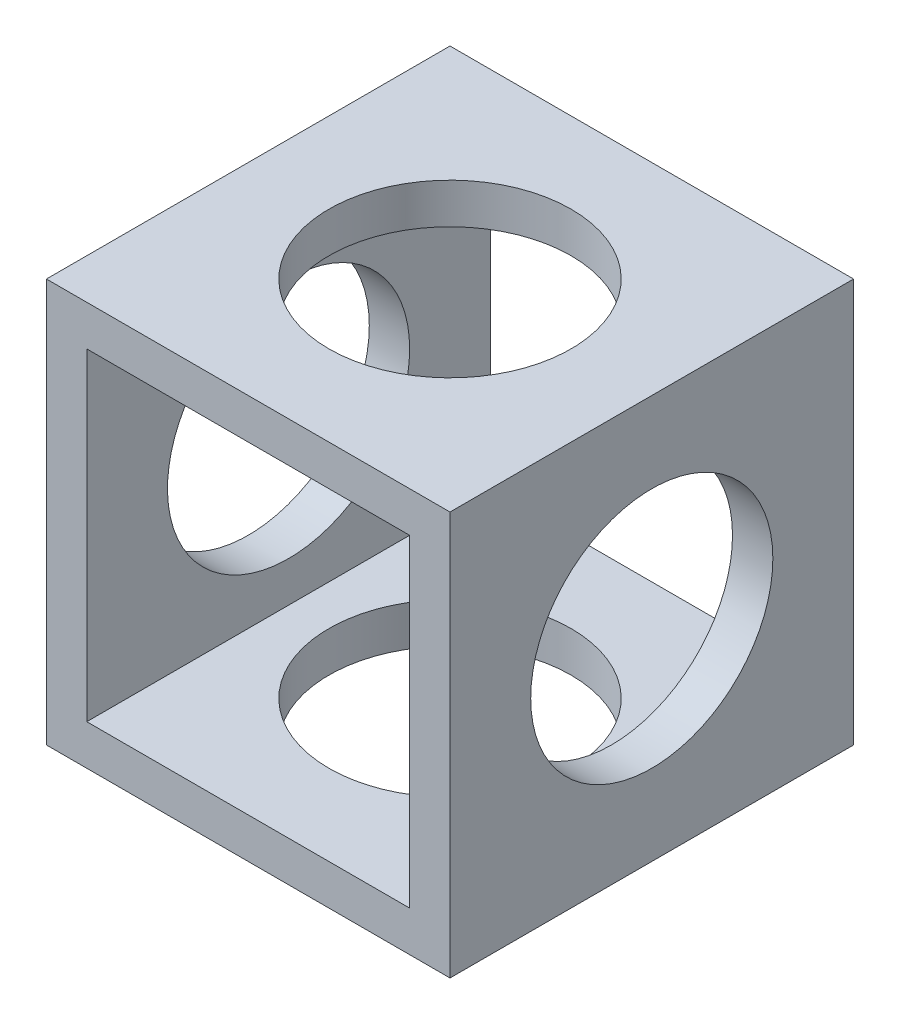
ISO-10303-21;
HEADER;
FILE_DESCRIPTION(('STEP AP214'),'2;1');
FILE_NAME('part.step','',(''),(''),'','','');
FILE_SCHEMA(('AUTOMOTIVE_DESIGN { 1 0 10303 214 1 1 1 1 }'));
ENDSEC;
DATA;
#1=APPLICATION_CONTEXT('core data for automotive mechanical design processes');
#2=APPLICATION_PROTOCOL_DEFINITION('international standard','automotive_design',2000,#1);
#3=PRODUCT_CONTEXT('',#1,'mechanical');
#4=PRODUCT('Part','Part','',(#3));
#5=PRODUCT_RELATED_PRODUCT_CATEGORY('part','',(#4));
#6=PRODUCT_DEFINITION_FORMATION('','',#4);
#7=PRODUCT_DEFINITION_CONTEXT('part definition',#1,'design');
#8=PRODUCT_DEFINITION('design','',#6,#7);
#9=PRODUCT_DEFINITION_SHAPE('','',#8);
#10=(LENGTH_UNIT() NAMED_UNIT(*) SI_UNIT(.MILLI.,.METRE.));
#11=(NAMED_UNIT(*) PLANE_ANGLE_UNIT() SI_UNIT($,.RADIAN.));
#12=(NAMED_UNIT(*) SI_UNIT($,.STERADIAN.) SOLID_ANGLE_UNIT());
#13=UNCERTAINTY_MEASURE_WITH_UNIT(LENGTH_MEASURE(1.E-05),#10,'distance_accuracy_value','');
#14=(GEOMETRIC_REPRESENTATION_CONTEXT(3) GLOBAL_UNCERTAINTY_ASSIGNED_CONTEXT((#13)) GLOBAL_UNIT_ASSIGNED_CONTEXT((#10,
#11,#12)) REPRESENTATION_CONTEXT('',''));
#15=CARTESIAN_POINT('',(0.,0.,0.));
#16=DIRECTION('',(0.,0.,1.));
#17=DIRECTION('',(1.,0.,0.));
#18=AXIS2_PLACEMENT_3D('',#15,#16,#17);
#19=CARTESIAN_POINT('',(0.,0.,25.));
#20=DIRECTION('',(0.,0.,1.));
#21=DIRECTION('',(1.,0.,0.));
#22=AXIS2_PLACEMENT_3D('',#19,#20,#21);
#23=PLANE('',#22);
#24=DIRECTION('',(0.,1.,0.));
#25=VECTOR('',#24,1.);
#26=CARTESIAN_POINT('',(25.,25.,25.));
#27=LINE('',#26,#25);
#28=CARTESIAN_POINT('',(25.,-25.,25.));
#29=VERTEX_POINT('',#28);
#30=CARTESIAN_POINT('',(25.,25.,25.));
#31=VERTEX_POINT('',#30);
#32=EDGE_CURVE('E161',#29,#31,#27,.T.);
#33=ORIENTED_EDGE('',*,*,#32,.T.);
#34=DIRECTION('',(-1.,0.,0.));
#35=VECTOR('',#34,1.);
#36=CARTESIAN_POINT('',(-25.,25.,25.));
#37=LINE('',#36,#35);
#38=CARTESIAN_POINT('',(-25.,25.,25.));
#39=VERTEX_POINT('',#38);
#40=EDGE_CURVE('E165',#31,#39,#37,.T.);
#41=ORIENTED_EDGE('',*,*,#40,.T.);
#42=DIRECTION('',(0.,-1.,0.));
#43=VECTOR('',#42,1.);
#44=CARTESIAN_POINT('',(-25.,25.,25.));
#45=LINE('',#44,#43);
#46=CARTESIAN_POINT('',(-25.,-25.,25.));
#47=VERTEX_POINT('',#46);
#48=EDGE_CURVE('E169',#39,#47,#45,.T.);
#49=ORIENTED_EDGE('',*,*,#48,.T.);
#50=DIRECTION('',(1.,0.,0.));
#51=VECTOR('',#50,1.);
#52=CARTESIAN_POINT('',(-25.,-25.,25.));
#53=LINE('',#52,#51);
#54=EDGE_CURVE('E172',#47,#29,#53,.T.);
#55=ORIENTED_EDGE('',*,*,#54,.T.);
#56=EDGE_LOOP('',(#33,#41,#49,#55));
#57=FACE_BOUND('',#56,.T.);
#58=DIRECTION('',(1.,0.,0.));
#59=VECTOR('',#58,1.);
#60=CARTESIAN_POINT('',(-20.,-20.,25.));
#61=LINE('',#60,#59);
#62=CARTESIAN_POINT('',(-20.,-20.,25.));
#63=VERTEX_POINT('',#62);
#64=CARTESIAN_POINT('',(20.,-20.,25.));
#65=VERTEX_POINT('',#64);
#66=EDGE_CURVE('E120',#63,#65,#61,.T.);
#67=ORIENTED_EDGE('',*,*,#66,.F.);
#68=DIRECTION('',(0.,-1.,0.));
#69=VECTOR('',#68,1.);
#70=CARTESIAN_POINT('',(-20.,20.,25.));
#71=LINE('',#70,#69);
#72=CARTESIAN_POINT('',(-20.,20.,25.));
#73=VERTEX_POINT('',#72);
#74=EDGE_CURVE('E111',#73,#63,#71,.T.);
#75=ORIENTED_EDGE('',*,*,#74,.F.);
#76=DIRECTION('',(-1.,0.,0.));
#77=VECTOR('',#76,1.);
#78=CARTESIAN_POINT('',(-20.,20.,25.));
#79=LINE('',#78,#77);
#80=CARTESIAN_POINT('',(20.,20.,25.));
#81=VERTEX_POINT('',#80);
#82=EDGE_CURVE('E137',#81,#73,#79,.T.);
#83=ORIENTED_EDGE('',*,*,#82,.F.);
#84=DIRECTION('',(0.,1.,0.));
#85=VECTOR('',#84,1.);
#86=CARTESIAN_POINT('',(20.,20.,25.));
#87=LINE('',#86,#85);
#88=EDGE_CURVE('E133',#65,#81,#87,.T.);
#89=ORIENTED_EDGE('',*,*,#88,.F.);
#90=EDGE_LOOP('',(#67,#75,#83,#89));
#91=FACE_BOUND('',#90,.T.);
#92=ADVANCED_FACE('F45',(#57,#91),#23,.T.);
#93=CARTESIAN_POINT('',(0.,0.,-25.));
#94=DIRECTION('',(0.,0.,1.));
#95=DIRECTION('',(1.,0.,0.));
#96=AXIS2_PLACEMENT_3D('',#93,#94,#95);
#97=PLANE('',#96);
#98=DIRECTION('',(0.,1.,0.));
#99=VECTOR('',#98,1.);
#100=CARTESIAN_POINT('',(25.,25.,-25.));
#101=LINE('',#100,#99);
#102=CARTESIAN_POINT('',(25.,-25.,-25.));
#103=VERTEX_POINT('',#102);
#104=CARTESIAN_POINT('',(25.,25.,-25.));
#105=VERTEX_POINT('',#104);
#106=EDGE_CURVE('E129',#103,#105,#101,.T.);
#107=ORIENTED_EDGE('',*,*,#106,.F.);
#108=DIRECTION('',(1.,0.,0.));
#109=VECTOR('',#108,1.);
#110=CARTESIAN_POINT('',(-25.,-25.,-25.));
#111=LINE('',#110,#109);
#112=CARTESIAN_POINT('',(-25.,-25.,-25.));
#113=VERTEX_POINT('',#112);
#114=EDGE_CURVE('E166',#113,#103,#111,.T.);
#115=ORIENTED_EDGE('',*,*,#114,.F.);
#116=DIRECTION('',(0.,-1.,0.));
#117=VECTOR('',#116,1.);
#118=CARTESIAN_POINT('',(-25.,25.,-25.));
#119=LINE('',#118,#117);
#120=CARTESIAN_POINT('',(-25.,25.,-25.));
#121=VERTEX_POINT('',#120);
#122=EDGE_CURVE('E182',#121,#113,#119,.T.);
#123=ORIENTED_EDGE('',*,*,#122,.F.);
#124=DIRECTION('',(-1.,0.,0.));
#125=VECTOR('',#124,1.);
#126=CARTESIAN_POINT('',(-25.,25.,-25.));
#127=LINE('',#126,#125);
#128=EDGE_CURVE('E179',#105,#121,#127,.T.);
#129=ORIENTED_EDGE('',*,*,#128,.F.);
#130=EDGE_LOOP('',(#107,#115,#123,#129));
#131=FACE_BOUND('',#130,.T.);
#132=DIRECTION('',(0.,-1.,0.));
#133=VECTOR('',#132,1.);
#134=CARTESIAN_POINT('',(-20.,20.,-25.));
#135=LINE('',#134,#133);
#136=CARTESIAN_POINT('',(-20.,20.,-25.));
#137=VERTEX_POINT('',#136);
#138=CARTESIAN_POINT('',(-20.,-20.,-25.));
#139=VERTEX_POINT('',#138);
#140=EDGE_CURVE('E69',#137,#139,#135,.T.);
#141=ORIENTED_EDGE('',*,*,#140,.T.);
#142=DIRECTION('',(1.,0.,0.));
#143=VECTOR('',#142,1.);
#144=CARTESIAN_POINT('',(-20.,-20.,-25.));
#145=LINE('',#144,#143);
#146=CARTESIAN_POINT('',(20.,-20.,-25.));
#147=VERTEX_POINT('',#146);
#148=EDGE_CURVE('E127',#139,#147,#145,.T.);
#149=ORIENTED_EDGE('',*,*,#148,.T.);
#150=DIRECTION('',(0.,1.,0.));
#151=VECTOR('',#150,1.);
#152=CARTESIAN_POINT('',(20.,20.,-25.));
#153=LINE('',#152,#151);
#154=CARTESIAN_POINT('',(20.,20.,-25.));
#155=VERTEX_POINT('',#154);
#156=EDGE_CURVE('E148',#147,#155,#153,.T.);
#157=ORIENTED_EDGE('',*,*,#156,.T.);
#158=DIRECTION('',(-1.,0.,0.));
#159=VECTOR('',#158,1.);
#160=CARTESIAN_POINT('',(-20.,20.,-25.));
#161=LINE('',#160,#159);
#162=EDGE_CURVE('E121',#155,#137,#161,.T.);
#163=ORIENTED_EDGE('',*,*,#162,.T.);
#164=EDGE_LOOP('',(#141,#149,#157,#163));
#165=FACE_BOUND('',#164,.T.);
#166=ADVANCED_FACE('F205',(#131,#165),#97,.F.);
#167=CARTESIAN_POINT('',(25.,25.,25.));
#168=DIRECTION('',(-1.,0.,0.));
#169=DIRECTION('',(0.,0.,1.));
#170=AXIS2_PLACEMENT_3D('',#167,#168,#169);
#171=PLANE('',#170);
#172=CARTESIAN_POINT('',(25.,0.,0.));
#173=DIRECTION('',(1.,0.,0.));
#174=DIRECTION('',(0.,0.,-1.));
#175=AXIS2_PLACEMENT_3D('',#172,#173,#174);
#176=CIRCLE('',#175,15.);
#177=CARTESIAN_POINT('',(25.,0.,-15.));
#178=VERTEX_POINT('',#177);
#179=EDGE_CURVE('E250',#178,#178,#176,.T.);
#180=ORIENTED_EDGE('',*,*,#179,.F.);
#181=EDGE_LOOP('',(#180));
#182=FACE_BOUND('',#181,.T.);
#183=ORIENTED_EDGE('',*,*,#106,.T.);
#184=DIRECTION('',(0.,0.,-1.));
#185=VECTOR('',#184,1.);
#186=CARTESIAN_POINT('',(25.,25.,25.));
#187=LINE('',#186,#185);
#188=EDGE_CURVE('E11',#31,#105,#187,.T.);
#189=ORIENTED_EDGE('',*,*,#188,.F.);
#190=ORIENTED_EDGE('',*,*,#32,.F.);
#191=DIRECTION('',(0.,0.,-1.));
#192=VECTOR('',#191,1.);
#193=CARTESIAN_POINT('',(25.,-25.,25.));
#194=LINE('',#193,#192);
#195=EDGE_CURVE('E175',#29,#103,#194,.T.);
#196=ORIENTED_EDGE('',*,*,#195,.T.);
#197=EDGE_LOOP('',(#183,#189,#190,#196));
#198=FACE_BOUND('',#197,.T.);
#199=ADVANCED_FACE('F47',(#182,#198),#171,.F.);
#200=CARTESIAN_POINT('',(-25.,25.,25.));
#201=DIRECTION('',(0.,-1.,0.));
#202=DIRECTION('',(0.,0.,-1.));
#203=AXIS2_PLACEMENT_3D('',#200,#201,#202);
#204=PLANE('',#203);
#205=CARTESIAN_POINT('',(0.,25.,0.));
#206=DIRECTION('',(0.,1.,0.));
#207=DIRECTION('',(0.,0.,1.));
#208=AXIS2_PLACEMENT_3D('',#205,#206,#207);
#209=CIRCLE('',#208,15.);
#210=CARTESIAN_POINT('',(0.,25.,15.));
#211=VERTEX_POINT('',#210);
#212=EDGE_CURVE('E379',#211,#211,#209,.T.);
#213=ORIENTED_EDGE('',*,*,#212,.F.);
#214=EDGE_LOOP('',(#213));
#215=FACE_BOUND('',#214,.T.);
#216=ORIENTED_EDGE('',*,*,#128,.T.);
#217=DIRECTION('',(0.,0.,-1.));
#218=VECTOR('',#217,1.);
#219=CARTESIAN_POINT('',(-25.,25.,25.));
#220=LINE('',#219,#218);
#221=EDGE_CURVE('E54',#39,#121,#220,.T.);
#222=ORIENTED_EDGE('',*,*,#221,.F.);
#223=ORIENTED_EDGE('',*,*,#40,.F.);
#224=ORIENTED_EDGE('',*,*,#188,.T.);
#225=EDGE_LOOP('',(#216,#222,#223,#224));
#226=FACE_BOUND('',#225,.T.);
#227=ADVANCED_FACE('F215',(#215,#226),#204,.F.);
#228=CARTESIAN_POINT('',(-25.,25.,25.));
#229=DIRECTION('',(1.,0.,0.));
#230=DIRECTION('',(0.,1.,0.));
#231=AXIS2_PLACEMENT_3D('',#228,#229,#230);
#232=PLANE('',#231);
#233=CARTESIAN_POINT('',(-25.,0.,0.));
#234=DIRECTION('',(1.,0.,0.));
#235=DIRECTION('',(0.,0.,-1.));
#236=AXIS2_PLACEMENT_3D('',#233,#234,#235);
#237=CIRCLE('',#236,15.);
#238=CARTESIAN_POINT('',(-25.,0.,-15.));
#239=VERTEX_POINT('',#238);
#240=EDGE_CURVE('E256',#239,#239,#237,.T.);
#241=ORIENTED_EDGE('',*,*,#240,.T.);
#242=EDGE_LOOP('',(#241));
#243=FACE_BOUND('',#242,.T.);
#244=ORIENTED_EDGE('',*,*,#122,.T.);
#245=DIRECTION('',(0.,0.,-1.));
#246=VECTOR('',#245,1.);
#247=CARTESIAN_POINT('',(-25.,-25.,25.));
#248=LINE('',#247,#246);
#249=EDGE_CURVE('E190',#47,#113,#248,.T.);
#250=ORIENTED_EDGE('',*,*,#249,.F.);
#251=ORIENTED_EDGE('',*,*,#48,.F.);
#252=ORIENTED_EDGE('',*,*,#221,.T.);
#253=EDGE_LOOP('',(#244,#250,#251,#252));
#254=FACE_BOUND('',#253,.T.);
#255=ADVANCED_FACE('F199',(#243,#254),#232,.F.);
#256=CARTESIAN_POINT('',(-25.,-25.,25.));
#257=DIRECTION('',(0.,1.,0.));
#258=DIRECTION('',(0.,0.,1.));
#259=AXIS2_PLACEMENT_3D('',#256,#257,#258);
#260=PLANE('',#259);
#261=CARTESIAN_POINT('',(0.,-25.,0.));
#262=DIRECTION('',(0.,1.,0.));
#263=DIRECTION('',(0.,0.,1.));
#264=AXIS2_PLACEMENT_3D('',#261,#262,#263);
#265=CIRCLE('',#264,15.);
#266=CARTESIAN_POINT('',(0.,-25.,15.));
#267=VERTEX_POINT('',#266);
#268=EDGE_CURVE('E247',#267,#267,#265,.T.);
#269=ORIENTED_EDGE('',*,*,#268,.T.);
#270=EDGE_LOOP('',(#269));
#271=FACE_BOUND('',#270,.T.);
#272=ORIENTED_EDGE('',*,*,#114,.T.);
#273=ORIENTED_EDGE('',*,*,#195,.F.);
#274=ORIENTED_EDGE('',*,*,#54,.F.);
#275=ORIENTED_EDGE('',*,*,#249,.T.);
#276=EDGE_LOOP('',(#272,#273,#274,#275));
#277=FACE_BOUND('',#276,.T.);
#278=ADVANCED_FACE('F209',(#271,#277),#260,.F.);
#279=CARTESIAN_POINT('',(-20.,20.,25.));
#280=DIRECTION('',(1.,0.,0.));
#281=DIRECTION('',(0.,1.,0.));
#282=AXIS2_PLACEMENT_3D('',#279,#280,#281);
#283=PLANE('',#282);
#284=CARTESIAN_POINT('',(-20.,0.,0.));
#285=DIRECTION('',(1.,0.,0.));
#286=DIRECTION('',(0.,1.,0.));
#287=AXIS2_PLACEMENT_3D('',#284,#285,#286);
#288=CIRCLE('',#287,15.);
#289=CARTESIAN_POINT('',(-20.,15.,0.));
#290=VERTEX_POINT('',#289);
#291=EDGE_CURVE('E266',#290,#290,#288,.T.);
#292=ORIENTED_EDGE('',*,*,#291,.F.);
#293=EDGE_LOOP('',(#292));
#294=FACE_BOUND('',#293,.T.);
#295=ORIENTED_EDGE('',*,*,#140,.F.);
#296=DIRECTION('',(0.,0.,-1.));
#297=VECTOR('',#296,1.);
#298=CARTESIAN_POINT('',(-20.,20.,25.));
#299=LINE('',#298,#297);
#300=EDGE_CURVE('E115',#73,#137,#299,.T.);
#301=ORIENTED_EDGE('',*,*,#300,.F.);
#302=ORIENTED_EDGE('',*,*,#74,.T.);
#303=DIRECTION('',(0.,0.,-1.));
#304=VECTOR('',#303,1.);
#305=CARTESIAN_POINT('',(-20.,-20.,25.));
#306=LINE('',#305,#304);
#307=EDGE_CURVE('E114',#63,#139,#306,.T.);
#308=ORIENTED_EDGE('',*,*,#307,.T.);
#309=EDGE_LOOP('',(#295,#301,#302,#308));
#310=FACE_BOUND('',#309,.T.);
#311=ADVANCED_FACE('F113',(#294,#310),#283,.T.);
#312=CARTESIAN_POINT('',(-20.,-20.,25.));
#313=DIRECTION('',(0.,1.,0.));
#314=DIRECTION('',(-1.,0.,0.));
#315=AXIS2_PLACEMENT_3D('',#312,#313,#314);
#316=PLANE('',#315);
#317=CARTESIAN_POINT('',(0.,-20.,0.));
#318=DIRECTION('',(0.,1.,0.));
#319=DIRECTION('',(0.,0.,1.));
#320=AXIS2_PLACEMENT_3D('',#317,#318,#319);
#321=CIRCLE('',#320,15.);
#322=CARTESIAN_POINT('',(0.,-20.,15.));
#323=VERTEX_POINT('',#322);
#324=EDGE_CURVE('E251',#323,#323,#321,.T.);
#325=ORIENTED_EDGE('',*,*,#324,.F.);
#326=EDGE_LOOP('',(#325));
#327=FACE_BOUND('',#326,.T.);
#328=ORIENTED_EDGE('',*,*,#148,.F.);
#329=ORIENTED_EDGE('',*,*,#307,.F.);
#330=ORIENTED_EDGE('',*,*,#66,.T.);
#331=DIRECTION('',(0.,0.,-1.));
#332=VECTOR('',#331,1.);
#333=CARTESIAN_POINT('',(20.,-20.,25.));
#334=LINE('',#333,#332);
#335=EDGE_CURVE('E130',#65,#147,#334,.T.);
#336=ORIENTED_EDGE('',*,*,#335,.T.);
#337=EDGE_LOOP('',(#328,#329,#330,#336));
#338=FACE_BOUND('',#337,.T.);
#339=ADVANCED_FACE('F124',(#327,#338),#316,.T.);
#340=CARTESIAN_POINT('',(20.,20.,25.));
#341=DIRECTION('',(-1.,0.,0.));
#342=DIRECTION('',(0.,-1.,0.));
#343=AXIS2_PLACEMENT_3D('',#340,#341,#342);
#344=PLANE('',#343);
#345=CARTESIAN_POINT('',(20.,0.,0.));
#346=DIRECTION('',(-1.,0.,0.));
#347=DIRECTION('',(0.,-1.,0.));
#348=AXIS2_PLACEMENT_3D('',#345,#346,#347);
#349=CIRCLE('',#348,15.);
#350=CARTESIAN_POINT('',(20.,-15.,0.));
#351=VERTEX_POINT('',#350);
#352=EDGE_CURVE('E145',#351,#351,#349,.T.);
#353=ORIENTED_EDGE('',*,*,#352,.F.);
#354=EDGE_LOOP('',(#353));
#355=FACE_BOUND('',#354,.T.);
#356=ORIENTED_EDGE('',*,*,#156,.F.);
#357=ORIENTED_EDGE('',*,*,#335,.F.);
#358=ORIENTED_EDGE('',*,*,#88,.T.);
#359=DIRECTION('',(0.,0.,-1.));
#360=VECTOR('',#359,1.);
#361=CARTESIAN_POINT('',(20.,20.,25.));
#362=LINE('',#361,#360);
#363=EDGE_CURVE('E61',#81,#155,#362,.T.);
#364=ORIENTED_EDGE('',*,*,#363,.T.);
#365=EDGE_LOOP('',(#356,#357,#358,#364));
#366=FACE_BOUND('',#365,.T.);
#367=ADVANCED_FACE('F276',(#355,#366),#344,.T.);
#368=CARTESIAN_POINT('',(-20.,20.,25.));
#369=DIRECTION('',(0.,-1.,0.));
#370=DIRECTION('',(0.,0.,-1.));
#371=AXIS2_PLACEMENT_3D('',#368,#369,#370);
#372=PLANE('',#371);
#373=CARTESIAN_POINT('',(0.,20.,0.));
#374=DIRECTION('',(0.,-1.,0.));
#375=DIRECTION('',(0.,0.,-1.));
#376=AXIS2_PLACEMENT_3D('',#373,#374,#375);
#377=CIRCLE('',#376,15.);
#378=CARTESIAN_POINT('',(0.,20.,-15.));
#379=VERTEX_POINT('',#378);
#380=EDGE_CURVE('E259',#379,#379,#377,.T.);
#381=ORIENTED_EDGE('',*,*,#380,.F.);
#382=EDGE_LOOP('',(#381));
#383=FACE_BOUND('',#382,.T.);
#384=ORIENTED_EDGE('',*,*,#162,.F.);
#385=ORIENTED_EDGE('',*,*,#363,.F.);
#386=ORIENTED_EDGE('',*,*,#82,.T.);
#387=ORIENTED_EDGE('',*,*,#300,.T.);
#388=EDGE_LOOP('',(#384,#385,#386,#387));
#389=FACE_BOUND('',#388,.T.);
#390=ADVANCED_FACE('F279',(#383,#389),#372,.T.);
#391=CARTESIAN_POINT('',(25.,0.,0.));
#392=DIRECTION('',(1.,0.,0.));
#393=DIRECTION('',(0.,0.,-1.));
#394=AXIS2_PLACEMENT_3D('',#391,#392,#393);
#395=CYLINDRICAL_SURFACE('',#394,15.);
#396=ORIENTED_EDGE('',*,*,#291,.T.);
#397=EDGE_LOOP('',(#396));
#398=FACE_BOUND('',#397,.T.);
#399=ORIENTED_EDGE('',*,*,#240,.F.);
#400=EDGE_LOOP('',(#399));
#401=FACE_BOUND('',#400,.T.);
#402=ADVANCED_FACE('F282',(#398,#401),#395,.F.);
#403=ORIENTED_EDGE('',*,*,#352,.T.);
#404=EDGE_LOOP('',(#403));
#405=FACE_BOUND('',#404,.T.);
#406=ORIENTED_EDGE('',*,*,#179,.T.);
#407=EDGE_LOOP('',(#406));
#408=FACE_BOUND('',#407,.T.);
#409=ADVANCED_FACE('F273',(#405,#408),#395,.F.);
#410=CARTESIAN_POINT('',(0.,-20.,0.));
#411=DIRECTION('',(0.,1.,0.));
#412=DIRECTION('',(0.,0.,1.));
#413=AXIS2_PLACEMENT_3D('',#410,#411,#412);
#414=CYLINDRICAL_SURFACE('',#413,15.);
#415=ORIENTED_EDGE('',*,*,#268,.F.);
#416=EDGE_LOOP('',(#415));
#417=FACE_BOUND('',#416,.T.);
#418=ORIENTED_EDGE('',*,*,#324,.T.);
#419=EDGE_LOOP('',(#418));
#420=FACE_BOUND('',#419,.T.);
#421=ADVANCED_FACE('F298',(#417,#420),#414,.F.);
#422=CARTESIAN_POINT('',(0.,25.,0.));
#423=DIRECTION('',(0.,1.,0.));
#424=DIRECTION('',(0.,0.,1.));
#425=AXIS2_PLACEMENT_3D('',#422,#423,#424);
#426=CYLINDRICAL_SURFACE('',#425,15.);
#427=ORIENTED_EDGE('',*,*,#380,.T.);
#428=EDGE_LOOP('',(#427));
#429=FACE_BOUND('',#428,.T.);
#430=ORIENTED_EDGE('',*,*,#212,.T.);
#431=EDGE_LOOP('',(#430));
#432=FACE_BOUND('',#431,.T.);
#433=ADVANCED_FACE('F299',(#429,#432),#426,.F.);
#434=CLOSED_SHELL('',(#92,#166,#199,#227,#255,#278,#311,#339,#367,#390,#402,#409,#421,#433));
#435=MANIFOLD_SOLID_BREP('B2',#434);
#436=ADVANCED_BREP_SHAPE_REPRESENTATION('',(#18,#435),#14);
#437=SHAPE_DEFINITION_REPRESENTATION(#9,#436);
ENDSEC;
END-ISO-10303-21;
